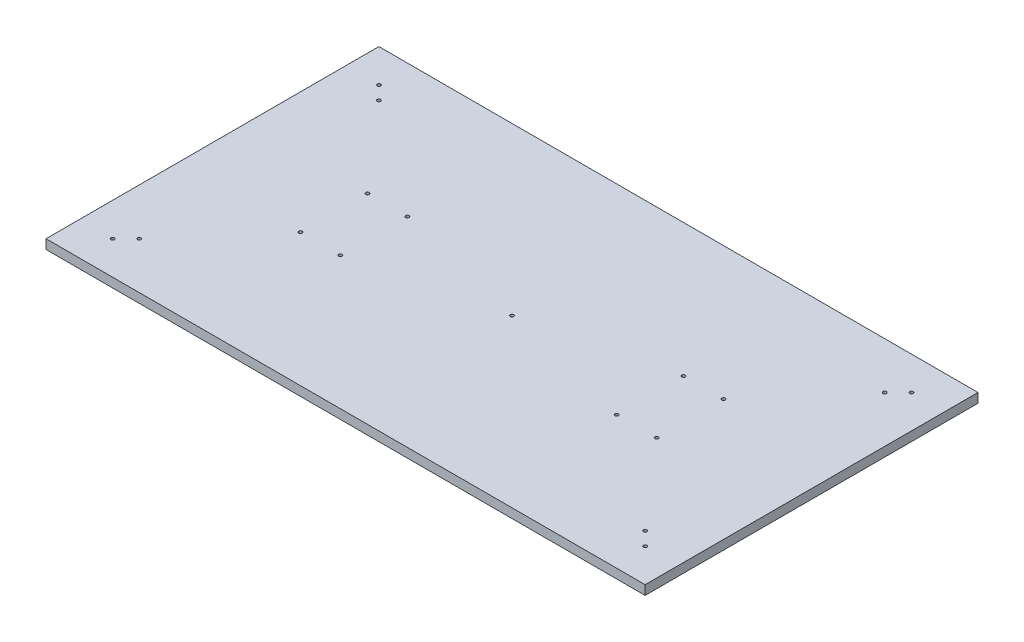
ISO-10303-21;
HEADER;
FILE_DESCRIPTION(('STEP AP214'),'2;1');
FILE_NAME('part.step','',(''),(''),'','','');
FILE_SCHEMA(('AUTOMOTIVE_DESIGN { 1 0 10303 214 1 1 1 1 }'));
ENDSEC;
DATA;
#1=APPLICATION_CONTEXT('core data for automotive mechanical design processes');
#2=APPLICATION_PROTOCOL_DEFINITION('international standard','automotive_design',2000,#1);
#3=PRODUCT_CONTEXT('',#1,'mechanical');
#4=PRODUCT('Part','Part','',(#3));
#5=PRODUCT_RELATED_PRODUCT_CATEGORY('part','',(#4));
#6=PRODUCT_DEFINITION_FORMATION('','',#4);
#7=PRODUCT_DEFINITION_CONTEXT('part definition',#1,'design');
#8=PRODUCT_DEFINITION('design','',#6,#7);
#9=PRODUCT_DEFINITION_SHAPE('','',#8);
#10=(LENGTH_UNIT() NAMED_UNIT(*) SI_UNIT(.MILLI.,.METRE.));
#11=(NAMED_UNIT(*) PLANE_ANGLE_UNIT() SI_UNIT($,.RADIAN.));
#12=(NAMED_UNIT(*) SI_UNIT($,.STERADIAN.) SOLID_ANGLE_UNIT());
#13=UNCERTAINTY_MEASURE_WITH_UNIT(LENGTH_MEASURE(1.E-05),#10,'distance_accuracy_value','');
#14=(GEOMETRIC_REPRESENTATION_CONTEXT(3) GLOBAL_UNCERTAINTY_ASSIGNED_CONTEXT((#13)) GLOBAL_UNIT_ASSIGNED_CONTEXT((#10,
#11,#12)) REPRESENTATION_CONTEXT('',''));
#15=CARTESIAN_POINT('',(0.,0.,0.));
#16=DIRECTION('',(0.,0.,1.));
#17=DIRECTION('',(1.,0.,0.));
#18=AXIS2_PLACEMENT_3D('',#15,#16,#17);
#19=CARTESIAN_POINT('',(450.,14.,-250.));
#20=DIRECTION('',(-1.,0.,0.));
#21=DIRECTION('',(0.,0.,1.));
#22=AXIS2_PLACEMENT_3D('',#19,#20,#21);
#23=PLANE('',#22);
#24=DIRECTION('',(0.,0.,-1.));
#25=VECTOR('',#24,1.);
#26=CARTESIAN_POINT('',(450.,0.,-250.));
#27=LINE('',#26,#25);
#28=CARTESIAN_POINT('',(450.,0.,250.));
#29=VERTEX_POINT('',#28);
#30=CARTESIAN_POINT('',(450.,0.,-250.));
#31=VERTEX_POINT('',#30);
#32=EDGE_CURVE('E102',#29,#31,#27,.T.);
#33=ORIENTED_EDGE('',*,*,#32,.T.);
#34=DIRECTION('',(0.,-1.,0.));
#35=VECTOR('',#34,1.);
#36=CARTESIAN_POINT('',(450.,14.,-250.));
#37=LINE('',#36,#35);
#38=CARTESIAN_POINT('',(450.,14.,-250.));
#39=VERTEX_POINT('',#38);
#40=EDGE_CURVE('E11',#39,#31,#37,.T.);
#41=ORIENTED_EDGE('',*,*,#40,.F.);
#42=DIRECTION('',(0.,0.,-1.));
#43=VECTOR('',#42,1.);
#44=CARTESIAN_POINT('',(450.,14.,-250.));
#45=LINE('',#44,#43);
#46=CARTESIAN_POINT('',(450.,14.,250.));
#47=VERTEX_POINT('',#46);
#48=EDGE_CURVE('E90',#47,#39,#45,.T.);
#49=ORIENTED_EDGE('',*,*,#48,.F.);
#50=DIRECTION('',(0.,-1.,0.));
#51=VECTOR('',#50,1.);
#52=CARTESIAN_POINT('',(450.,14.,250.));
#53=LINE('',#52,#51);
#54=EDGE_CURVE('E98',#47,#29,#53,.T.);
#55=ORIENTED_EDGE('',*,*,#54,.T.);
#56=EDGE_LOOP('',(#33,#41,#49,#55));
#57=FACE_BOUND('',#56,.T.);
#58=ADVANCED_FACE('F39',(#57),#23,.F.);
#59=CARTESIAN_POINT('',(-450.,14.,-250.));
#60=DIRECTION('',(0.,0.,1.));
#61=DIRECTION('',(1.,0.,0.));
#62=AXIS2_PLACEMENT_3D('',#59,#60,#61);
#63=PLANE('',#62);
#64=DIRECTION('',(-1.,0.,0.));
#65=VECTOR('',#64,1.);
#66=CARTESIAN_POINT('',(-450.,0.,-250.));
#67=LINE('',#66,#65);
#68=CARTESIAN_POINT('',(-450.,0.,-250.));
#69=VERTEX_POINT('',#68);
#70=EDGE_CURVE('E94',#31,#69,#67,.T.);
#71=ORIENTED_EDGE('',*,*,#70,.T.);
#72=DIRECTION('',(0.,-1.,0.));
#73=VECTOR('',#72,1.);
#74=CARTESIAN_POINT('',(-450.,14.,-250.));
#75=LINE('',#74,#73);
#76=CARTESIAN_POINT('',(-450.,14.,-250.));
#77=VERTEX_POINT('',#76);
#78=EDGE_CURVE('E47',#77,#69,#75,.T.);
#79=ORIENTED_EDGE('',*,*,#78,.F.);
#80=DIRECTION('',(-1.,0.,0.));
#81=VECTOR('',#80,1.);
#82=CARTESIAN_POINT('',(-450.,14.,-250.));
#83=LINE('',#82,#81);
#84=EDGE_CURVE('E85',#39,#77,#83,.T.);
#85=ORIENTED_EDGE('',*,*,#84,.F.);
#86=ORIENTED_EDGE('',*,*,#40,.T.);
#87=EDGE_LOOP('',(#71,#79,#85,#86));
#88=FACE_BOUND('',#87,.T.);
#89=ADVANCED_FACE('F93',(#88),#63,.F.);
#90=CARTESIAN_POINT('',(-450.,14.,-250.));
#91=DIRECTION('',(1.,0.,0.));
#92=DIRECTION('',(0.,0.,-1.));
#93=AXIS2_PLACEMENT_3D('',#90,#91,#92);
#94=PLANE('',#93);
#95=DIRECTION('',(0.,0.,1.));
#96=VECTOR('',#95,1.);
#97=CARTESIAN_POINT('',(-450.,0.,-250.));
#98=LINE('',#97,#96);
#99=CARTESIAN_POINT('',(-450.,0.,250.));
#100=VERTEX_POINT('',#99);
#101=EDGE_CURVE('E72',#69,#100,#98,.T.);
#102=ORIENTED_EDGE('',*,*,#101,.T.);
#103=DIRECTION('',(0.,-1.,0.));
#104=VECTOR('',#103,1.);
#105=CARTESIAN_POINT('',(-450.,14.,250.));
#106=LINE('',#105,#104);
#107=CARTESIAN_POINT('',(-450.,14.,250.));
#108=VERTEX_POINT('',#107);
#109=EDGE_CURVE('E95',#108,#100,#106,.T.);
#110=ORIENTED_EDGE('',*,*,#109,.F.);
#111=DIRECTION('',(0.,0.,1.));
#112=VECTOR('',#111,1.);
#113=CARTESIAN_POINT('',(-450.,14.,-250.));
#114=LINE('',#113,#112);
#115=EDGE_CURVE('E88',#77,#108,#114,.T.);
#116=ORIENTED_EDGE('',*,*,#115,.F.);
#117=ORIENTED_EDGE('',*,*,#78,.T.);
#118=EDGE_LOOP('',(#102,#110,#116,#117));
#119=FACE_BOUND('',#118,.T.);
#120=ADVANCED_FACE('F96',(#119),#94,.F.);
#121=CARTESIAN_POINT('',(-450.,14.,250.));
#122=DIRECTION('',(0.,0.,-1.));
#123=DIRECTION('',(-1.,0.,0.));
#124=AXIS2_PLACEMENT_3D('',#121,#122,#123);
#125=PLANE('',#124);
#126=DIRECTION('',(1.,0.,0.));
#127=VECTOR('',#126,1.);
#128=CARTESIAN_POINT('',(-450.,0.,250.));
#129=LINE('',#128,#127);
#130=EDGE_CURVE('E78',#100,#29,#129,.T.);
#131=ORIENTED_EDGE('',*,*,#130,.T.);
#132=ORIENTED_EDGE('',*,*,#54,.F.);
#133=DIRECTION('',(1.,0.,0.));
#134=VECTOR('',#133,1.);
#135=CARTESIAN_POINT('',(-450.,14.,250.));
#136=LINE('',#135,#134);
#137=EDGE_CURVE('E55',#108,#47,#136,.T.);
#138=ORIENTED_EDGE('',*,*,#137,.F.);
#139=ORIENTED_EDGE('',*,*,#109,.T.);
#140=EDGE_LOOP('',(#131,#132,#138,#139));
#141=FACE_BOUND('',#140,.T.);
#142=ADVANCED_FACE('F110',(#141),#125,.F.);
#143=CARTESIAN_POINT('',(0.,14.,0.));
#144=DIRECTION('',(0.,1.,0.));
#145=DIRECTION('',(0.,0.,1.));
#146=AXIS2_PLACEMENT_3D('',#143,#144,#145);
#147=PLANE('',#146);
#148=CARTESIAN_POINT('',(-267.5,14.,-50.2999999999998));
#149=DIRECTION('',(0.,1.,0.));
#150=DIRECTION('',(0.,0.,-1.));
#151=AXIS2_PLACEMENT_3D('',#148,#149,#150);
#152=CIRCLE('',#151,2.60000000000002);
#153=CARTESIAN_POINT('',(-267.5,14.,-52.8999999999999));
#154=VERTEX_POINT('',#153);
#155=EDGE_CURVE('E149',#154,#154,#152,.T.);
#156=ORIENTED_EDGE('',*,*,#155,.F.);
#157=EDGE_LOOP('',(#156));
#158=FACE_BOUND('',#157,.T.);
#159=CARTESIAN_POINT('',(-267.5,14.,50.3000000000002));
#160=DIRECTION('',(0.,1.,0.));
#161=DIRECTION('',(0.,0.,1.));
#162=AXIS2_PLACEMENT_3D('',#159,#160,#161);
#163=CIRCLE('',#162,2.60000000000002);
#164=CARTESIAN_POINT('',(-267.5,14.,52.9000000000002));
#165=VERTEX_POINT('',#164);
#166=EDGE_CURVE('E156',#165,#165,#163,.T.);
#167=ORIENTED_EDGE('',*,*,#166,.F.);
#168=EDGE_LOOP('',(#167));
#169=FACE_BOUND('',#168,.T.);
#170=CARTESIAN_POINT('',(380.,14.,-180.));
#171=DIRECTION('',(0.,1.,0.));
#172=DIRECTION('',(0.,0.,1.));
#173=AXIS2_PLACEMENT_3D('',#170,#171,#172);
#174=CIRCLE('',#173,2.60000000000001);
#175=CARTESIAN_POINT('',(380.,14.,-177.4));
#176=VERTEX_POINT('',#175);
#177=EDGE_CURVE('E162',#176,#176,#174,.T.);
#178=ORIENTED_EDGE('',*,*,#177,.F.);
#179=EDGE_LOOP('',(#178));
#180=FACE_BOUND('',#179,.T.);
#181=CARTESIAN_POINT('',(400.,14.,-200.));
#182=DIRECTION('',(0.,1.,0.));
#183=DIRECTION('',(0.,0.,1.));
#184=AXIS2_PLACEMENT_3D('',#181,#182,#183);
#185=CIRCLE('',#184,2.60000000000001);
#186=CARTESIAN_POINT('',(400.,14.,-197.4));
#187=VERTEX_POINT('',#186);
#188=EDGE_CURVE('E126',#187,#187,#185,.T.);
#189=ORIENTED_EDGE('',*,*,#188,.F.);
#190=EDGE_LOOP('',(#189));
#191=FACE_BOUND('',#190,.T.);
#192=CARTESIAN_POINT('',(0.,14.,0.));
#193=DIRECTION('',(0.,1.,0.));
#194=DIRECTION('',(0.,0.,1.));
#195=AXIS2_PLACEMENT_3D('',#192,#193,#194);
#196=CIRCLE('',#195,2.6);
#197=CARTESIAN_POINT('',(0.,14.,2.60000000000002));
#198=VERTEX_POINT('',#197);
#199=EDGE_CURVE('E125',#198,#198,#196,.T.);
#200=ORIENTED_EDGE('',*,*,#199,.F.);
#201=EDGE_LOOP('',(#200));
#202=FACE_BOUND('',#201,.T.);
#203=CARTESIAN_POINT('',(380.,14.,180.));
#204=DIRECTION('',(0.,1.,0.));
#205=DIRECTION('',(0.,0.,-1.));
#206=AXIS2_PLACEMENT_3D('',#203,#204,#205);
#207=CIRCLE('',#206,2.60000000000001);
#208=CARTESIAN_POINT('',(380.,14.,177.4));
#209=VERTEX_POINT('',#208);
#210=EDGE_CURVE('E132',#209,#209,#207,.T.);
#211=ORIENTED_EDGE('',*,*,#210,.F.);
#212=EDGE_LOOP('',(#211));
#213=FACE_BOUND('',#212,.T.);
#214=CARTESIAN_POINT('',(-207.5,14.,50.3));
#215=DIRECTION('',(0.,1.,0.));
#216=DIRECTION('',(0.,0.,1.));
#217=AXIS2_PLACEMENT_3D('',#214,#215,#216);
#218=CIRCLE('',#217,2.59999999999991);
#219=CARTESIAN_POINT('',(-207.5,14.,52.8999999999999));
#220=VERTEX_POINT('',#219);
#221=EDGE_CURVE('E138',#220,#220,#218,.T.);
#222=ORIENTED_EDGE('',*,*,#221,.F.);
#223=EDGE_LOOP('',(#222));
#224=FACE_BOUND('',#223,.T.);
#225=CARTESIAN_POINT('',(-207.5,14.,-50.3));
#226=DIRECTION('',(0.,1.,0.));
#227=DIRECTION('',(0.,0.,1.));
#228=AXIS2_PLACEMENT_3D('',#225,#226,#227);
#229=CIRCLE('',#228,2.59999999999999);
#230=CARTESIAN_POINT('',(-207.5,14.,-47.7));
#231=VERTEX_POINT('',#230);
#232=EDGE_CURVE('E119',#231,#231,#229,.T.);
#233=ORIENTED_EDGE('',*,*,#232,.F.);
#234=EDGE_LOOP('',(#233));
#235=FACE_BOUND('',#234,.T.);
#236=CARTESIAN_POINT('',(207.5,14.,-50.3));
#237=DIRECTION('',(0.,1.,0.));
#238=DIRECTION('',(0.,0.,-1.));
#239=AXIS2_PLACEMENT_3D('',#236,#237,#238);
#240=CIRCLE('',#239,2.59999999999999);
#241=CARTESIAN_POINT('',(207.5,14.,-52.9));
#242=VERTEX_POINT('',#241);
#243=EDGE_CURVE('E197',#242,#242,#240,.T.);
#244=ORIENTED_EDGE('',*,*,#243,.F.);
#245=EDGE_LOOP('',(#244));
#246=FACE_BOUND('',#245,.T.);
#247=CARTESIAN_POINT('',(207.5,14.,50.3));
#248=DIRECTION('',(0.,1.,0.));
#249=DIRECTION('',(0.,0.,-1.));
#250=AXIS2_PLACEMENT_3D('',#247,#248,#249);
#251=CIRCLE('',#250,2.59999999999991);
#252=CARTESIAN_POINT('',(207.5,14.,47.7000000000001));
#253=VERTEX_POINT('',#252);
#254=EDGE_CURVE('E203',#253,#253,#251,.T.);
#255=ORIENTED_EDGE('',*,*,#254,.F.);
#256=EDGE_LOOP('',(#255));
#257=FACE_BOUND('',#256,.T.);
#258=CARTESIAN_POINT('',(-400.,14.,-200.));
#259=DIRECTION('',(0.,1.,0.));
#260=DIRECTION('',(0.,0.,-1.));
#261=AXIS2_PLACEMENT_3D('',#258,#259,#260);
#262=CIRCLE('',#261,2.60000000000001);
#263=CARTESIAN_POINT('',(-400.,14.,-202.6));
#264=VERTEX_POINT('',#263);
#265=EDGE_CURVE('E209',#264,#264,#262,.T.);
#266=ORIENTED_EDGE('',*,*,#265,.F.);
#267=EDGE_LOOP('',(#266));
#268=FACE_BOUND('',#267,.T.);
#269=CARTESIAN_POINT('',(-380.,14.,-180.));
#270=DIRECTION('',(0.,1.,0.));
#271=DIRECTION('',(0.,0.,-1.));
#272=AXIS2_PLACEMENT_3D('',#269,#270,#271);
#273=CIRCLE('',#272,2.60000000000001);
#274=CARTESIAN_POINT('',(-380.,14.,-182.6));
#275=VERTEX_POINT('',#274);
#276=EDGE_CURVE('E174',#275,#275,#273,.T.);
#277=ORIENTED_EDGE('',*,*,#276,.F.);
#278=EDGE_LOOP('',(#277));
#279=FACE_BOUND('',#278,.T.);
#280=CARTESIAN_POINT('',(267.5,14.,50.3000000000002));
#281=DIRECTION('',(0.,1.,0.));
#282=DIRECTION('',(0.,0.,-1.));
#283=AXIS2_PLACEMENT_3D('',#280,#281,#282);
#284=CIRCLE('',#283,2.60000000000002);
#285=CARTESIAN_POINT('',(267.5,14.,47.7000000000002));
#286=VERTEX_POINT('',#285);
#287=EDGE_CURVE('E173',#286,#286,#284,.T.);
#288=ORIENTED_EDGE('',*,*,#287,.F.);
#289=EDGE_LOOP('',(#288));
#290=FACE_BOUND('',#289,.T.);
#291=CARTESIAN_POINT('',(267.5,14.,-50.2999999999998));
#292=DIRECTION('',(0.,1.,0.));
#293=DIRECTION('',(0.,0.,1.));
#294=AXIS2_PLACEMENT_3D('',#291,#292,#293);
#295=CIRCLE('',#294,2.60000000000002);
#296=CARTESIAN_POINT('',(267.5,14.,-47.6999999999998));
#297=VERTEX_POINT('',#296);
#298=EDGE_CURVE('E180',#297,#297,#295,.T.);
#299=ORIENTED_EDGE('',*,*,#298,.F.);
#300=EDGE_LOOP('',(#299));
#301=FACE_BOUND('',#300,.T.);
#302=CARTESIAN_POINT('',(-380.,14.,180.));
#303=DIRECTION('',(0.,1.,0.));
#304=DIRECTION('',(0.,0.,1.));
#305=AXIS2_PLACEMENT_3D('',#302,#303,#304);
#306=CIRCLE('',#305,2.60000000000001);
#307=CARTESIAN_POINT('',(-380.,14.,182.6));
#308=VERTEX_POINT('',#307);
#309=EDGE_CURVE('E186',#308,#308,#306,.T.);
#310=ORIENTED_EDGE('',*,*,#309,.F.);
#311=EDGE_LOOP('',(#310));
#312=FACE_BOUND('',#311,.T.);
#313=CARTESIAN_POINT('',(-400.,14.,200.));
#314=DIRECTION('',(0.,1.,0.));
#315=DIRECTION('',(0.,0.,1.));
#316=AXIS2_PLACEMENT_3D('',#313,#314,#315);
#317=CIRCLE('',#316,2.60000000000001);
#318=CARTESIAN_POINT('',(-400.,14.,202.6));
#319=VERTEX_POINT('',#318);
#320=EDGE_CURVE('E150',#319,#319,#317,.T.);
#321=ORIENTED_EDGE('',*,*,#320,.F.);
#322=EDGE_LOOP('',(#321));
#323=FACE_BOUND('',#322,.T.);
#324=CARTESIAN_POINT('',(400.,14.,200.));
#325=DIRECTION('',(0.,1.,0.));
#326=DIRECTION('',(0.,0.,-1.));
#327=AXIS2_PLACEMENT_3D('',#324,#325,#326);
#328=CIRCLE('',#327,2.60000000000001);
#329=CARTESIAN_POINT('',(400.,14.,197.4));
#330=VERTEX_POINT('',#329);
#331=EDGE_CURVE('E116',#330,#330,#328,.T.);
#332=ORIENTED_EDGE('',*,*,#331,.F.);
#333=EDGE_LOOP('',(#332));
#334=FACE_BOUND('',#333,.T.);
#335=ORIENTED_EDGE('',*,*,#48,.T.);
#336=ORIENTED_EDGE('',*,*,#84,.T.);
#337=ORIENTED_EDGE('',*,*,#115,.T.);
#338=ORIENTED_EDGE('',*,*,#137,.T.);
#339=EDGE_LOOP('',(#335,#336,#337,#338));
#340=FACE_BOUND('',#339,.T.);
#341=ADVANCED_FACE('F86',(#158,#169,#180,#191,#202,#213,#224,#235,#246,#257,#268,#279,#290,#301,
#312,#323,#334,#340),#147,.T.);
#342=CARTESIAN_POINT('',(0.,0.,0.));
#343=DIRECTION('',(0.,1.,0.));
#344=DIRECTION('',(0.,0.,1.));
#345=AXIS2_PLACEMENT_3D('',#342,#343,#344);
#346=PLANE('',#345);
#347=ORIENTED_EDGE('',*,*,#32,.F.);
#348=ORIENTED_EDGE('',*,*,#130,.F.);
#349=ORIENTED_EDGE('',*,*,#101,.F.);
#350=ORIENTED_EDGE('',*,*,#70,.F.);
#351=EDGE_LOOP('',(#347,#348,#349,#350));
#352=FACE_BOUND('',#351,.T.);
#353=ADVANCED_FACE('F113',(#352),#346,.F.);
#354=CARTESIAN_POINT('',(400.,4.,200.));
#355=DIRECTION('',(0.,1.,0.));
#356=DIRECTION('',(0.,0.,1.));
#357=AXIS2_PLACEMENT_3D('',#354,#355,#356);
#358=CYLINDRICAL_SURFACE('',#357,2.60000000000001);
#359=CARTESIAN_POINT('',(400.,4.,200.));
#360=DIRECTION('',(0.,1.,0.));
#361=DIRECTION('',(0.,0.,-1.));
#362=AXIS2_PLACEMENT_3D('',#359,#360,#361);
#363=CIRCLE('',#362,2.60000000000001);
#364=CARTESIAN_POINT('',(400.,4.,197.4));
#365=VERTEX_POINT('',#364);
#366=EDGE_CURVE('E105',#365,#365,#363,.T.);
#367=ORIENTED_EDGE('',*,*,#366,.F.);
#368=EDGE_LOOP('',(#367));
#369=FACE_BOUND('',#368,.T.);
#370=ORIENTED_EDGE('',*,*,#331,.T.);
#371=EDGE_LOOP('',(#370));
#372=FACE_BOUND('',#371,.T.);
#373=ADVANCED_FACE('F234',(#369,#372),#358,.F.);
#374=CARTESIAN_POINT('',(400.,4.,200.));
#375=DIRECTION('',(0.,-1.,0.));
#376=DIRECTION('',(0.,0.,-1.));
#377=AXIS2_PLACEMENT_3D('',#374,#375,#376);
#378=PLANE('',#377);
#379=ORIENTED_EDGE('',*,*,#366,.T.);
#380=EDGE_LOOP('',(#379));
#381=FACE_BOUND('',#380,.T.);
#382=ADVANCED_FACE('F236',(#381),#378,.F.);
#383=CARTESIAN_POINT('',(-400.,4.,200.));
#384=DIRECTION('',(0.,1.,0.));
#385=DIRECTION('',(0.,0.,1.));
#386=AXIS2_PLACEMENT_3D('',#383,#384,#385);
#387=CYLINDRICAL_SURFACE('',#386,2.60000000000001);
#388=CARTESIAN_POINT('',(-400.,4.,200.));
#389=DIRECTION('',(0.,1.,0.));
#390=DIRECTION('',(0.,0.,1.));
#391=AXIS2_PLACEMENT_3D('',#388,#389,#390);
#392=CIRCLE('',#391,2.60000000000001);
#393=CARTESIAN_POINT('',(-400.,4.,202.6));
#394=VERTEX_POINT('',#393);
#395=EDGE_CURVE('E189',#394,#394,#392,.T.);
#396=ORIENTED_EDGE('',*,*,#395,.F.);
#397=EDGE_LOOP('',(#396));
#398=FACE_BOUND('',#397,.T.);
#399=ORIENTED_EDGE('',*,*,#320,.T.);
#400=EDGE_LOOP('',(#399));
#401=FACE_BOUND('',#400,.T.);
#402=ADVANCED_FACE('F242',(#398,#401),#387,.F.);
#403=CARTESIAN_POINT('',(-400.,4.,200.));
#404=DIRECTION('',(0.,1.,0.));
#405=DIRECTION('',(0.,0.,1.));
#406=AXIS2_PLACEMENT_3D('',#403,#404,#405);
#407=PLANE('',#406);
#408=ORIENTED_EDGE('',*,*,#395,.T.);
#409=EDGE_LOOP('',(#408));
#410=FACE_BOUND('',#409,.T.);
#411=ADVANCED_FACE('F293',(#410),#407,.T.);
#412=CARTESIAN_POINT('',(-380.,4.,180.));
#413=DIRECTION('',(0.,1.,0.));
#414=DIRECTION('',(0.,0.,1.));
#415=AXIS2_PLACEMENT_3D('',#412,#413,#414);
#416=CYLINDRICAL_SURFACE('',#415,2.60000000000001);
#417=CARTESIAN_POINT('',(-380.,4.,180.));
#418=DIRECTION('',(0.,1.,0.));
#419=DIRECTION('',(0.,0.,1.));
#420=AXIS2_PLACEMENT_3D('',#417,#418,#419);
#421=CIRCLE('',#420,2.60000000000001);
#422=CARTESIAN_POINT('',(-380.,4.,182.6));
#423=VERTEX_POINT('',#422);
#424=EDGE_CURVE('E183',#423,#423,#421,.T.);
#425=ORIENTED_EDGE('',*,*,#424,.F.);
#426=EDGE_LOOP('',(#425));
#427=FACE_BOUND('',#426,.T.);
#428=ORIENTED_EDGE('',*,*,#309,.T.);
#429=EDGE_LOOP('',(#428));
#430=FACE_BOUND('',#429,.T.);
#431=ADVANCED_FACE('F302',(#427,#430),#416,.F.);
#432=CARTESIAN_POINT('',(-380.,4.,180.));
#433=DIRECTION('',(0.,1.,0.));
#434=DIRECTION('',(0.,0.,1.));
#435=AXIS2_PLACEMENT_3D('',#432,#433,#434);
#436=PLANE('',#435);
#437=ORIENTED_EDGE('',*,*,#424,.T.);
#438=EDGE_LOOP('',(#437));
#439=FACE_BOUND('',#438,.T.);
#440=ADVANCED_FACE('F311',(#439),#436,.T.);
#441=CARTESIAN_POINT('',(267.5,4.,-50.2999999999998));
#442=DIRECTION('',(0.,1.,0.));
#443=DIRECTION('',(0.,0.,1.));
#444=AXIS2_PLACEMENT_3D('',#441,#442,#443);
#445=CYLINDRICAL_SURFACE('',#444,2.60000000000002);
#446=CARTESIAN_POINT('',(267.5,4.,-50.2999999999998));
#447=DIRECTION('',(0.,1.,0.));
#448=DIRECTION('',(0.,0.,1.));
#449=AXIS2_PLACEMENT_3D('',#446,#447,#448);
#450=CIRCLE('',#449,2.60000000000002);
#451=CARTESIAN_POINT('',(267.5,4.,-47.6999999999998));
#452=VERTEX_POINT('',#451);
#453=EDGE_CURVE('E177',#452,#452,#450,.T.);
#454=ORIENTED_EDGE('',*,*,#453,.F.);
#455=EDGE_LOOP('',(#454));
#456=FACE_BOUND('',#455,.T.);
#457=ORIENTED_EDGE('',*,*,#298,.T.);
#458=EDGE_LOOP('',(#457));
#459=FACE_BOUND('',#458,.T.);
#460=ADVANCED_FACE('F320',(#456,#459),#445,.F.);
#461=CARTESIAN_POINT('',(267.5,4.,-50.2999999999998));
#462=DIRECTION('',(0.,1.,0.));
#463=DIRECTION('',(0.,0.,1.));
#464=AXIS2_PLACEMENT_3D('',#461,#462,#463);
#465=PLANE('',#464);
#466=ORIENTED_EDGE('',*,*,#453,.T.);
#467=EDGE_LOOP('',(#466));
#468=FACE_BOUND('',#467,.T.);
#469=ADVANCED_FACE('F329',(#468),#465,.T.);
#470=CARTESIAN_POINT('',(267.5,4.,50.3000000000002));
#471=DIRECTION('',(0.,1.,0.));
#472=DIRECTION('',(0.,0.,1.));
#473=AXIS2_PLACEMENT_3D('',#470,#471,#472);
#474=CYLINDRICAL_SURFACE('',#473,2.60000000000002);
#475=CARTESIAN_POINT('',(267.5,4.,50.3000000000002));
#476=DIRECTION('',(0.,1.,0.));
#477=DIRECTION('',(0.,0.,-1.));
#478=AXIS2_PLACEMENT_3D('',#475,#476,#477);
#479=CIRCLE('',#478,2.60000000000002);
#480=CARTESIAN_POINT('',(267.5,4.,47.7000000000002));
#481=VERTEX_POINT('',#480);
#482=EDGE_CURVE('E170',#481,#481,#479,.T.);
#483=ORIENTED_EDGE('',*,*,#482,.F.);
#484=EDGE_LOOP('',(#483));
#485=FACE_BOUND('',#484,.T.);
#486=ORIENTED_EDGE('',*,*,#287,.T.);
#487=EDGE_LOOP('',(#486));
#488=FACE_BOUND('',#487,.T.);
#489=ADVANCED_FACE('F338',(#485,#488),#474,.F.);
#490=CARTESIAN_POINT('',(267.5,4.,50.3000000000002));
#491=DIRECTION('',(0.,-1.,0.));
#492=DIRECTION('',(0.,0.,-1.));
#493=AXIS2_PLACEMENT_3D('',#490,#491,#492);
#494=PLANE('',#493);
#495=ORIENTED_EDGE('',*,*,#482,.T.);
#496=EDGE_LOOP('',(#495));
#497=FACE_BOUND('',#496,.T.);
#498=ADVANCED_FACE('F347',(#497),#494,.F.);
#499=CARTESIAN_POINT('',(-380.,4.,-180.));
#500=DIRECTION('',(0.,1.,0.));
#501=DIRECTION('',(0.,0.,1.));
#502=AXIS2_PLACEMENT_3D('',#499,#500,#501);
#503=CYLINDRICAL_SURFACE('',#502,2.60000000000001);
#504=CARTESIAN_POINT('',(-380.,4.,-180.));
#505=DIRECTION('',(0.,1.,0.));
#506=DIRECTION('',(0.,0.,-1.));
#507=AXIS2_PLACEMENT_3D('',#504,#505,#506);
#508=CIRCLE('',#507,2.60000000000001);
#509=CARTESIAN_POINT('',(-380.,4.,-182.6));
#510=VERTEX_POINT('',#509);
#511=EDGE_CURVE('E212',#510,#510,#508,.T.);
#512=ORIENTED_EDGE('',*,*,#511,.F.);
#513=EDGE_LOOP('',(#512));
#514=FACE_BOUND('',#513,.T.);
#515=ORIENTED_EDGE('',*,*,#276,.T.);
#516=EDGE_LOOP('',(#515));
#517=FACE_BOUND('',#516,.T.);
#518=ADVANCED_FACE('F218',(#514,#517),#503,.F.);
#519=CARTESIAN_POINT('',(-380.,4.,-180.));
#520=DIRECTION('',(0.,-1.,0.));
#521=DIRECTION('',(0.,0.,-1.));
#522=AXIS2_PLACEMENT_3D('',#519,#520,#521);
#523=PLANE('',#522);
#524=ORIENTED_EDGE('',*,*,#511,.T.);
#525=EDGE_LOOP('',(#524));
#526=FACE_BOUND('',#525,.T.);
#527=ADVANCED_FACE('F364',(#526),#523,.F.);
#528=CARTESIAN_POINT('',(-400.,4.,-200.));
#529=DIRECTION('',(0.,1.,0.));
#530=DIRECTION('',(0.,0.,1.));
#531=AXIS2_PLACEMENT_3D('',#528,#529,#530);
#532=CYLINDRICAL_SURFACE('',#531,2.60000000000001);
#533=CARTESIAN_POINT('',(-400.,4.,-200.));
#534=DIRECTION('',(0.,1.,0.));
#535=DIRECTION('',(0.,0.,-1.));
#536=AXIS2_PLACEMENT_3D('',#533,#534,#535);
#537=CIRCLE('',#536,2.60000000000001);
#538=CARTESIAN_POINT('',(-400.,4.,-202.6));
#539=VERTEX_POINT('',#538);
#540=EDGE_CURVE('E206',#539,#539,#537,.T.);
#541=ORIENTED_EDGE('',*,*,#540,.F.);
#542=EDGE_LOOP('',(#541));
#543=FACE_BOUND('',#542,.T.);
#544=ORIENTED_EDGE('',*,*,#265,.T.);
#545=EDGE_LOOP('',(#544));
#546=FACE_BOUND('',#545,.T.);
#547=ADVANCED_FACE('F373',(#543,#546),#532,.F.);
#548=CARTESIAN_POINT('',(-400.,4.,-200.));
#549=DIRECTION('',(0.,-1.,0.));
#550=DIRECTION('',(0.,0.,-1.));
#551=AXIS2_PLACEMENT_3D('',#548,#549,#550);
#552=PLANE('',#551);
#553=ORIENTED_EDGE('',*,*,#540,.T.);
#554=EDGE_LOOP('',(#553));
#555=FACE_BOUND('',#554,.T.);
#556=ADVANCED_FACE('F382',(#555),#552,.F.);
#557=CARTESIAN_POINT('',(207.5,4.,50.3));
#558=DIRECTION('',(0.,1.,0.));
#559=DIRECTION('',(0.,0.,1.));
#560=AXIS2_PLACEMENT_3D('',#557,#558,#559);
#561=CYLINDRICAL_SURFACE('',#560,2.59999999999991);
#562=CARTESIAN_POINT('',(207.5,4.,50.3));
#563=DIRECTION('',(0.,1.,0.));
#564=DIRECTION('',(0.,0.,-1.));
#565=AXIS2_PLACEMENT_3D('',#562,#563,#564);
#566=CIRCLE('',#565,2.59999999999991);
#567=CARTESIAN_POINT('',(207.5,4.,47.7000000000001));
#568=VERTEX_POINT('',#567);
#569=EDGE_CURVE('E200',#568,#568,#566,.T.);
#570=ORIENTED_EDGE('',*,*,#569,.F.);
#571=EDGE_LOOP('',(#570));
#572=FACE_BOUND('',#571,.T.);
#573=ORIENTED_EDGE('',*,*,#254,.T.);
#574=EDGE_LOOP('',(#573));
#575=FACE_BOUND('',#574,.T.);
#576=ADVANCED_FACE('F391',(#572,#575),#561,.F.);
#577=CARTESIAN_POINT('',(207.5,4.,50.3));
#578=DIRECTION('',(0.,-1.,0.));
#579=DIRECTION('',(0.,0.,-1.));
#580=AXIS2_PLACEMENT_3D('',#577,#578,#579);
#581=PLANE('',#580);
#582=ORIENTED_EDGE('',*,*,#569,.T.);
#583=EDGE_LOOP('',(#582));
#584=FACE_BOUND('',#583,.T.);
#585=ADVANCED_FACE('F400',(#584),#581,.F.);
#586=CARTESIAN_POINT('',(207.5,4.,-50.3));
#587=DIRECTION('',(0.,1.,0.));
#588=DIRECTION('',(0.,0.,1.));
#589=AXIS2_PLACEMENT_3D('',#586,#587,#588);
#590=CYLINDRICAL_SURFACE('',#589,2.59999999999999);
#591=CARTESIAN_POINT('',(207.5,4.,-50.3));
#592=DIRECTION('',(0.,1.,0.));
#593=DIRECTION('',(0.,0.,-1.));
#594=AXIS2_PLACEMENT_3D('',#591,#592,#593);
#595=CIRCLE('',#594,2.59999999999999);
#596=CARTESIAN_POINT('',(207.5,4.,-52.9));
#597=VERTEX_POINT('',#596);
#598=EDGE_CURVE('E194',#597,#597,#595,.T.);
#599=ORIENTED_EDGE('',*,*,#598,.F.);
#600=EDGE_LOOP('',(#599));
#601=FACE_BOUND('',#600,.T.);
#602=ORIENTED_EDGE('',*,*,#243,.T.);
#603=EDGE_LOOP('',(#602));
#604=FACE_BOUND('',#603,.T.);
#605=ADVANCED_FACE('F409',(#601,#604),#590,.F.);
#606=CARTESIAN_POINT('',(207.5,4.,-50.3));
#607=DIRECTION('',(0.,-1.,0.));
#608=DIRECTION('',(0.,0.,-1.));
#609=AXIS2_PLACEMENT_3D('',#606,#607,#608);
#610=PLANE('',#609);
#611=ORIENTED_EDGE('',*,*,#598,.T.);
#612=EDGE_LOOP('',(#611));
#613=FACE_BOUND('',#612,.T.);
#614=ADVANCED_FACE('F418',(#613),#610,.F.);
#615=CARTESIAN_POINT('',(-207.5,4.,-50.3));
#616=DIRECTION('',(0.,1.,0.));
#617=DIRECTION('',(0.,0.,1.));
#618=AXIS2_PLACEMENT_3D('',#615,#616,#617);
#619=CYLINDRICAL_SURFACE('',#618,2.59999999999999);
#620=CARTESIAN_POINT('',(-207.5,4.,-50.3));
#621=DIRECTION('',(0.,1.,0.));
#622=DIRECTION('',(0.,0.,1.));
#623=AXIS2_PLACEMENT_3D('',#620,#621,#622);
#624=CIRCLE('',#623,2.59999999999999);
#625=CARTESIAN_POINT('',(-207.5,4.,-47.7));
#626=VERTEX_POINT('',#625);
#627=EDGE_CURVE('E141',#626,#626,#624,.T.);
#628=ORIENTED_EDGE('',*,*,#627,.F.);
#629=EDGE_LOOP('',(#628));
#630=FACE_BOUND('',#629,.T.);
#631=ORIENTED_EDGE('',*,*,#232,.T.);
#632=EDGE_LOOP('',(#631));
#633=FACE_BOUND('',#632,.T.);
#634=ADVANCED_FACE('F427',(#630,#633),#619,.F.);
#635=CARTESIAN_POINT('',(-207.5,4.,-50.3));
#636=DIRECTION('',(0.,1.,0.));
#637=DIRECTION('',(0.,0.,1.));
#638=AXIS2_PLACEMENT_3D('',#635,#636,#637);
#639=PLANE('',#638);
#640=ORIENTED_EDGE('',*,*,#627,.T.);
#641=EDGE_LOOP('',(#640));
#642=FACE_BOUND('',#641,.T.);
#643=ADVANCED_FACE('F436',(#642),#639,.T.);
#644=CARTESIAN_POINT('',(-207.5,4.,50.3));
#645=DIRECTION('',(0.,1.,0.));
#646=DIRECTION('',(0.,0.,1.));
#647=AXIS2_PLACEMENT_3D('',#644,#645,#646);
#648=CYLINDRICAL_SURFACE('',#647,2.59999999999991);
#649=CARTESIAN_POINT('',(-207.5,4.,50.3));
#650=DIRECTION('',(0.,1.,0.));
#651=DIRECTION('',(0.,0.,1.));
#652=AXIS2_PLACEMENT_3D('',#649,#650,#651);
#653=CIRCLE('',#652,2.59999999999991);
#654=CARTESIAN_POINT('',(-207.5,4.,52.8999999999999));
#655=VERTEX_POINT('',#654);
#656=EDGE_CURVE('E135',#655,#655,#653,.T.);
#657=ORIENTED_EDGE('',*,*,#656,.F.);
#658=EDGE_LOOP('',(#657));
#659=FACE_BOUND('',#658,.T.);
#660=ORIENTED_EDGE('',*,*,#221,.T.);
#661=EDGE_LOOP('',(#660));
#662=FACE_BOUND('',#661,.T.);
#663=ADVANCED_FACE('F445',(#659,#662),#648,.F.);
#664=CARTESIAN_POINT('',(-207.5,4.,50.3));
#665=DIRECTION('',(0.,1.,0.));
#666=DIRECTION('',(0.,0.,1.));
#667=AXIS2_PLACEMENT_3D('',#664,#665,#666);
#668=PLANE('',#667);
#669=ORIENTED_EDGE('',*,*,#656,.T.);
#670=EDGE_LOOP('',(#669));
#671=FACE_BOUND('',#670,.T.);
#672=ADVANCED_FACE('F454',(#671),#668,.T.);
#673=CARTESIAN_POINT('',(380.,4.,180.));
#674=DIRECTION('',(0.,1.,0.));
#675=DIRECTION('',(0.,0.,1.));
#676=AXIS2_PLACEMENT_3D('',#673,#674,#675);
#677=CYLINDRICAL_SURFACE('',#676,2.60000000000001);
#678=CARTESIAN_POINT('',(380.,4.,180.));
#679=DIRECTION('',(0.,1.,0.));
#680=DIRECTION('',(0.,0.,-1.));
#681=AXIS2_PLACEMENT_3D('',#678,#679,#680);
#682=CIRCLE('',#681,2.60000000000001);
#683=CARTESIAN_POINT('',(380.,4.,177.4));
#684=VERTEX_POINT('',#683);
#685=EDGE_CURVE('E129',#684,#684,#682,.T.);
#686=ORIENTED_EDGE('',*,*,#685,.F.);
#687=EDGE_LOOP('',(#686));
#688=FACE_BOUND('',#687,.T.);
#689=ORIENTED_EDGE('',*,*,#210,.T.);
#690=EDGE_LOOP('',(#689));
#691=FACE_BOUND('',#690,.T.);
#692=ADVANCED_FACE('F463',(#688,#691),#677,.F.);
#693=CARTESIAN_POINT('',(380.,4.,180.));
#694=DIRECTION('',(0.,-1.,0.));
#695=DIRECTION('',(0.,0.,-1.));
#696=AXIS2_PLACEMENT_3D('',#693,#694,#695);
#697=PLANE('',#696);
#698=ORIENTED_EDGE('',*,*,#685,.T.);
#699=EDGE_LOOP('',(#698));
#700=FACE_BOUND('',#699,.T.);
#701=ADVANCED_FACE('F472',(#700),#697,.F.);
#702=CARTESIAN_POINT('',(0.,4.,0.));
#703=DIRECTION('',(0.,1.,0.));
#704=DIRECTION('',(0.,0.,1.));
#705=AXIS2_PLACEMENT_3D('',#702,#703,#704);
#706=CYLINDRICAL_SURFACE('',#705,2.6);
#707=CARTESIAN_POINT('',(0.,4.,0.));
#708=DIRECTION('',(0.,1.,0.));
#709=DIRECTION('',(0.,0.,1.));
#710=AXIS2_PLACEMENT_3D('',#707,#708,#709);
#711=CIRCLE('',#710,2.6);
#712=CARTESIAN_POINT('',(0.,4.,2.60000000000002));
#713=VERTEX_POINT('',#712);
#714=EDGE_CURVE('E122',#713,#713,#711,.T.);
#715=ORIENTED_EDGE('',*,*,#714,.F.);
#716=EDGE_LOOP('',(#715));
#717=FACE_BOUND('',#716,.T.);
#718=ORIENTED_EDGE('',*,*,#199,.T.);
#719=EDGE_LOOP('',(#718));
#720=FACE_BOUND('',#719,.T.);
#721=ADVANCED_FACE('F481',(#717,#720),#706,.F.);
#722=CARTESIAN_POINT('',(0.,4.,0.));
#723=DIRECTION('',(0.,1.,0.));
#724=DIRECTION('',(0.,0.,1.));
#725=AXIS2_PLACEMENT_3D('',#722,#723,#724);
#726=PLANE('',#725);
#727=ORIENTED_EDGE('',*,*,#714,.T.);
#728=EDGE_LOOP('',(#727));
#729=FACE_BOUND('',#728,.T.);
#730=ADVANCED_FACE('F490',(#729),#726,.T.);
#731=CARTESIAN_POINT('',(400.,4.,-200.));
#732=DIRECTION('',(0.,1.,0.));
#733=DIRECTION('',(0.,0.,1.));
#734=AXIS2_PLACEMENT_3D('',#731,#732,#733);
#735=CYLINDRICAL_SURFACE('',#734,2.60000000000001);
#736=CARTESIAN_POINT('',(400.,4.,-200.));
#737=DIRECTION('',(0.,1.,0.));
#738=DIRECTION('',(0.,0.,1.));
#739=AXIS2_PLACEMENT_3D('',#736,#737,#738);
#740=CIRCLE('',#739,2.60000000000001);
#741=CARTESIAN_POINT('',(400.,4.,-197.4));
#742=VERTEX_POINT('',#741);
#743=EDGE_CURVE('E165',#742,#742,#740,.T.);
#744=ORIENTED_EDGE('',*,*,#743,.F.);
#745=EDGE_LOOP('',(#744));
#746=FACE_BOUND('',#745,.T.);
#747=ORIENTED_EDGE('',*,*,#188,.T.);
#748=EDGE_LOOP('',(#747));
#749=FACE_BOUND('',#748,.T.);
#750=ADVANCED_FACE('F499',(#746,#749),#735,.F.);
#751=CARTESIAN_POINT('',(400.,4.,-200.));
#752=DIRECTION('',(0.,1.,0.));
#753=DIRECTION('',(0.,0.,1.));
#754=AXIS2_PLACEMENT_3D('',#751,#752,#753);
#755=PLANE('',#754);
#756=ORIENTED_EDGE('',*,*,#743,.T.);
#757=EDGE_LOOP('',(#756));
#758=FACE_BOUND('',#757,.T.);
#759=ADVANCED_FACE('F508',(#758),#755,.T.);
#760=CARTESIAN_POINT('',(380.,4.,-180.));
#761=DIRECTION('',(0.,1.,0.));
#762=DIRECTION('',(0.,0.,1.));
#763=AXIS2_PLACEMENT_3D('',#760,#761,#762);
#764=CYLINDRICAL_SURFACE('',#763,2.60000000000001);
#765=CARTESIAN_POINT('',(380.,4.,-180.));
#766=DIRECTION('',(0.,1.,0.));
#767=DIRECTION('',(0.,0.,1.));
#768=AXIS2_PLACEMENT_3D('',#765,#766,#767);
#769=CIRCLE('',#768,2.60000000000001);
#770=CARTESIAN_POINT('',(380.,4.,-177.4));
#771=VERTEX_POINT('',#770);
#772=EDGE_CURVE('E159',#771,#771,#769,.T.);
#773=ORIENTED_EDGE('',*,*,#772,.F.);
#774=EDGE_LOOP('',(#773));
#775=FACE_BOUND('',#774,.T.);
#776=ORIENTED_EDGE('',*,*,#177,.T.);
#777=EDGE_LOOP('',(#776));
#778=FACE_BOUND('',#777,.T.);
#779=ADVANCED_FACE('F517',(#775,#778),#764,.F.);
#780=CARTESIAN_POINT('',(380.,4.,-180.));
#781=DIRECTION('',(0.,1.,0.));
#782=DIRECTION('',(0.,0.,1.));
#783=AXIS2_PLACEMENT_3D('',#780,#781,#782);
#784=PLANE('',#783);
#785=ORIENTED_EDGE('',*,*,#772,.T.);
#786=EDGE_LOOP('',(#785));
#787=FACE_BOUND('',#786,.T.);
#788=ADVANCED_FACE('F526',(#787),#784,.T.);
#789=CARTESIAN_POINT('',(-267.5,4.,50.3000000000002));
#790=DIRECTION('',(0.,1.,0.));
#791=DIRECTION('',(0.,0.,1.));
#792=AXIS2_PLACEMENT_3D('',#789,#790,#791);
#793=CYLINDRICAL_SURFACE('',#792,2.60000000000002);
#794=CARTESIAN_POINT('',(-267.5,4.,50.3000000000002));
#795=DIRECTION('',(0.,1.,0.));
#796=DIRECTION('',(0.,0.,1.));
#797=AXIS2_PLACEMENT_3D('',#794,#795,#796);
#798=CIRCLE('',#797,2.60000000000002);
#799=CARTESIAN_POINT('',(-267.5,4.,52.9000000000002));
#800=VERTEX_POINT('',#799);
#801=EDGE_CURVE('E153',#800,#800,#798,.T.);
#802=ORIENTED_EDGE('',*,*,#801,.F.);
#803=EDGE_LOOP('',(#802));
#804=FACE_BOUND('',#803,.T.);
#805=ORIENTED_EDGE('',*,*,#166,.T.);
#806=EDGE_LOOP('',(#805));
#807=FACE_BOUND('',#806,.T.);
#808=ADVANCED_FACE('F535',(#804,#807),#793,.F.);
#809=CARTESIAN_POINT('',(-267.5,4.,50.3000000000002));
#810=DIRECTION('',(0.,1.,0.));
#811=DIRECTION('',(0.,0.,1.));
#812=AXIS2_PLACEMENT_3D('',#809,#810,#811);
#813=PLANE('',#812);
#814=ORIENTED_EDGE('',*,*,#801,.T.);
#815=EDGE_LOOP('',(#814));
#816=FACE_BOUND('',#815,.T.);
#817=ADVANCED_FACE('F544',(#816),#813,.T.);
#818=CARTESIAN_POINT('',(-267.5,4.,-50.2999999999998));
#819=DIRECTION('',(0.,1.,0.));
#820=DIRECTION('',(0.,0.,1.));
#821=AXIS2_PLACEMENT_3D('',#818,#819,#820);
#822=CYLINDRICAL_SURFACE('',#821,2.60000000000002);
#823=CARTESIAN_POINT('',(-267.5,4.,-50.2999999999998));
#824=DIRECTION('',(0.,1.,0.));
#825=DIRECTION('',(0.,0.,-1.));
#826=AXIS2_PLACEMENT_3D('',#823,#824,#825);
#827=CIRCLE('',#826,2.60000000000002);
#828=CARTESIAN_POINT('',(-267.5,4.,-52.8999999999999));
#829=VERTEX_POINT('',#828);
#830=EDGE_CURVE('E146',#829,#829,#827,.T.);
#831=ORIENTED_EDGE('',*,*,#830,.F.);
#832=EDGE_LOOP('',(#831));
#833=FACE_BOUND('',#832,.T.);
#834=ORIENTED_EDGE('',*,*,#155,.T.);
#835=EDGE_LOOP('',(#834));
#836=FACE_BOUND('',#835,.T.);
#837=ADVANCED_FACE('F553',(#833,#836),#822,.F.);
#838=CARTESIAN_POINT('',(-267.5,4.,-50.2999999999998));
#839=DIRECTION('',(0.,-1.,0.));
#840=DIRECTION('',(0.,0.,-1.));
#841=AXIS2_PLACEMENT_3D('',#838,#839,#840);
#842=PLANE('',#841);
#843=ORIENTED_EDGE('',*,*,#830,.T.);
#844=EDGE_LOOP('',(#843));
#845=FACE_BOUND('',#844,.T.);
#846=ADVANCED_FACE('F562',(#845),#842,.F.);
#847=CLOSED_SHELL('',(#58,#89,#120,#142,#341,#353,#373,#382,#402,#411,#431,#440,#460,#469,#489,
#498,#518,#527,#547,#556,#576,#585,#605,#614,#634,#643,#663,#672,#692,#701,#721,#730,#750,#759,
#779,#788,#808,#817,#837,#846));
#848=MANIFOLD_SOLID_BREP('B2',#847);
#849=ADVANCED_BREP_SHAPE_REPRESENTATION('',(#18,#848),#14);
#850=SHAPE_DEFINITION_REPRESENTATION(#9,#849);
ENDSEC;
END-ISO-10303-21;
